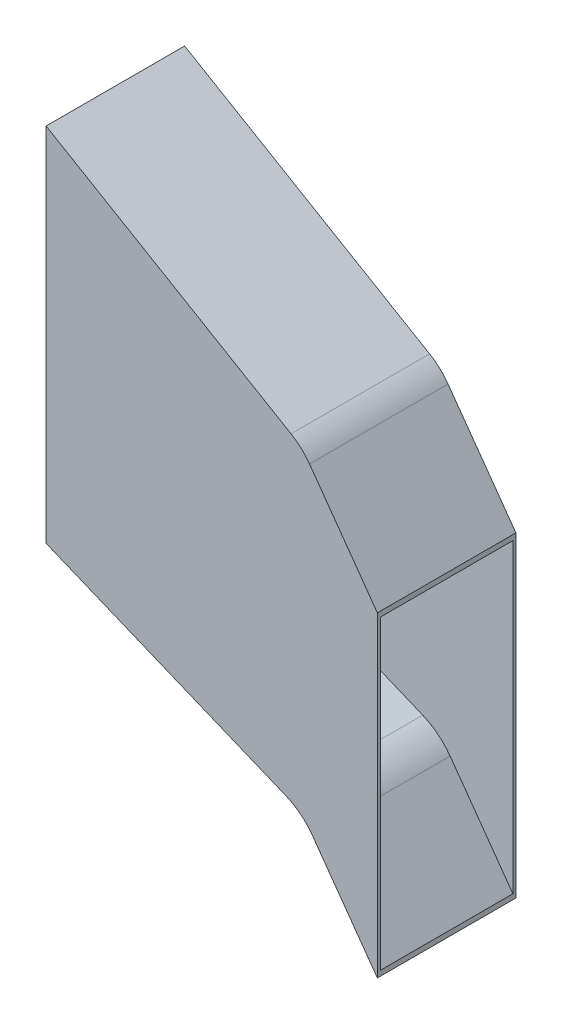
ISO-10303-21;
HEADER;
FILE_DESCRIPTION(('STEP AP214'),'2;1');
FILE_NAME('part.step','',(''),(''),'','','');
FILE_SCHEMA(('AUTOMOTIVE_DESIGN { 1 0 10303 214 1 1 1 1 }'));
ENDSEC;
DATA;
#1=APPLICATION_CONTEXT('core data for automotive mechanical design processes');
#2=APPLICATION_PROTOCOL_DEFINITION('international standard','automotive_design',2000,#1);
#3=PRODUCT_CONTEXT('',#1,'mechanical');
#4=PRODUCT('Part','Part','',(#3));
#5=PRODUCT_RELATED_PRODUCT_CATEGORY('part','',(#4));
#6=PRODUCT_DEFINITION_FORMATION('','',#4);
#7=PRODUCT_DEFINITION_CONTEXT('part definition',#1,'design');
#8=PRODUCT_DEFINITION('design','',#6,#7);
#9=PRODUCT_DEFINITION_SHAPE('','',#8);
#10=(LENGTH_UNIT() NAMED_UNIT(*) SI_UNIT(.MILLI.,.METRE.));
#11=(NAMED_UNIT(*) PLANE_ANGLE_UNIT() SI_UNIT($,.RADIAN.));
#12=(NAMED_UNIT(*) SI_UNIT($,.STERADIAN.) SOLID_ANGLE_UNIT());
#13=UNCERTAINTY_MEASURE_WITH_UNIT(LENGTH_MEASURE(1.E-05),#10,'distance_accuracy_value','');
#14=(GEOMETRIC_REPRESENTATION_CONTEXT(3) GLOBAL_UNCERTAINTY_ASSIGNED_CONTEXT((#13)) GLOBAL_UNIT_ASSIGNED_CONTEXT((#10,
#11,#12)) REPRESENTATION_CONTEXT('',''));
#15=CARTESIAN_POINT('',(0.,0.,0.));
#16=DIRECTION('',(0.,0.,1.));
#17=DIRECTION('',(1.,0.,0.));
#18=AXIS2_PLACEMENT_3D('',#15,#16,#17);
#19=CARTESIAN_POINT('',(0.,0.,116.84));
#20=DIRECTION('',(-1.,0.,0.));
#21=DIRECTION('',(0.,0.,1.));
#22=AXIS2_PLACEMENT_3D('',#19,#20,#21);
#23=PLANE('',#22);
#24=DIRECTION('',(0.,1.,0.));
#25=VECTOR('',#24,1.);
#26=CARTESIAN_POINT('',(0.,0.,0.));
#27=LINE('',#26,#25);
#28=CARTESIAN_POINT('',(0.,0.,0.));
#29=VERTEX_POINT('',#28);
#30=CARTESIAN_POINT('',(0.,266.7,0.));
#31=VERTEX_POINT('',#30);
#32=EDGE_CURVE('E251',#29,#31,#27,.T.);
#33=ORIENTED_EDGE('',*,*,#32,.T.);
#34=DIRECTION('',(0.,0.,-1.));
#35=VECTOR('',#34,1.);
#36=CARTESIAN_POINT('',(0.,266.7,116.84));
#37=LINE('',#36,#35);
#38=CARTESIAN_POINT('',(0.,266.7,116.84));
#39=VERTEX_POINT('',#38);
#40=EDGE_CURVE('E275',#39,#31,#37,.T.);
#41=ORIENTED_EDGE('',*,*,#40,.F.);
#42=DIRECTION('',(0.,1.,0.));
#43=VECTOR('',#42,1.);
#44=CARTESIAN_POINT('',(0.,0.,116.84));
#45=LINE('',#44,#43);
#46=CARTESIAN_POINT('',(0.,0.,116.84));
#47=VERTEX_POINT('',#46);
#48=EDGE_CURVE('E229',#47,#39,#45,.T.);
#49=ORIENTED_EDGE('',*,*,#48,.F.);
#50=DIRECTION('',(0.,0.,-1.));
#51=VECTOR('',#50,1.);
#52=CARTESIAN_POINT('',(0.,0.,116.84));
#53=LINE('',#52,#51);
#54=EDGE_CURVE('E279',#47,#29,#53,.T.);
#55=ORIENTED_EDGE('',*,*,#54,.T.);
#56=EDGE_LOOP('',(#33,#41,#49,#55));
#57=FACE_BOUND('',#56,.T.);
#58=DIRECTION('',(0.,1.,0.));
#59=VECTOR('',#58,1.);
#60=CARTESIAN_POINT('',(0.,0.,2.54));
#61=LINE('',#60,#59);
#62=CARTESIAN_POINT('',(0.,4.36998123565764,2.54));
#63=VERTEX_POINT('',#62);
#64=CARTESIAN_POINT('',(0.,262.330018764342,2.54));
#65=VERTEX_POINT('',#64);
#66=EDGE_CURVE('E202',#63,#65,#61,.T.);
#67=ORIENTED_EDGE('',*,*,#66,.F.);
#68=DIRECTION('',(0.,0.,-1.));
#69=VECTOR('',#68,1.);
#70=CARTESIAN_POINT('',(0.,4.36998123565764,116.84));
#71=LINE('',#70,#69);
#72=CARTESIAN_POINT('',(0.,4.36998123565764,114.3));
#73=VERTEX_POINT('',#72);
#74=EDGE_CURVE('E186',#73,#63,#71,.T.);
#75=ORIENTED_EDGE('',*,*,#74,.F.);
#76=DIRECTION('',(0.,1.,0.));
#77=VECTOR('',#76,1.);
#78=CARTESIAN_POINT('',(0.,0.,114.3));
#79=LINE('',#78,#77);
#80=CARTESIAN_POINT('',(0.,262.330018764342,114.3));
#81=VERTEX_POINT('',#80);
#82=EDGE_CURVE('E63',#73,#81,#79,.T.);
#83=ORIENTED_EDGE('',*,*,#82,.T.);
#84=DIRECTION('',(0.,0.,-1.));
#85=VECTOR('',#84,1.);
#86=CARTESIAN_POINT('',(0.,262.330018764342,116.84));
#87=LINE('',#86,#85);
#88=EDGE_CURVE('E192',#81,#65,#87,.T.);
#89=ORIENTED_EDGE('',*,*,#88,.T.);
#90=EDGE_LOOP('',(#67,#75,#83,#89));
#91=FACE_BOUND('',#90,.T.);
#92=ADVANCED_FACE('F47',(#57,#91),#23,.F.);
#93=CARTESIAN_POINT('',(-279.4,482.6,116.84));
#94=DIRECTION('',(1.,0.,0.));
#95=DIRECTION('',(0.,1.,0.));
#96=AXIS2_PLACEMENT_3D('',#93,#94,#95);
#97=PLANE('',#96);
#98=DIRECTION('',(0.,-1.,0.));
#99=VECTOR('',#98,1.);
#100=CARTESIAN_POINT('',(-279.4,482.6,0.));
#101=LINE('',#100,#99);
#102=CARTESIAN_POINT('',(-279.4,482.6,0.));
#103=VERTEX_POINT('',#102);
#104=CARTESIAN_POINT('',(-279.4,177.8,0.));
#105=VERTEX_POINT('',#104);
#106=EDGE_CURVE('E262',#103,#105,#101,.T.);
#107=ORIENTED_EDGE('',*,*,#106,.T.);
#108=DIRECTION('',(0.,0.,-1.));
#109=VECTOR('',#108,1.);
#110=CARTESIAN_POINT('',(-279.4,177.8,116.84));
#111=LINE('',#110,#109);
#112=CARTESIAN_POINT('',(-279.4,177.8,116.84));
#113=VERTEX_POINT('',#112);
#114=EDGE_CURVE('E247',#113,#105,#111,.T.);
#115=ORIENTED_EDGE('',*,*,#114,.F.);
#116=DIRECTION('',(0.,-1.,0.));
#117=VECTOR('',#116,1.);
#118=CARTESIAN_POINT('',(-279.4,482.6,116.84));
#119=LINE('',#118,#117);
#120=CARTESIAN_POINT('',(-279.4,482.6,116.84));
#121=VERTEX_POINT('',#120);
#122=EDGE_CURVE('E240',#121,#113,#119,.T.);
#123=ORIENTED_EDGE('',*,*,#122,.F.);
#124=DIRECTION('',(0.,0.,-1.));
#125=VECTOR('',#124,1.);
#126=CARTESIAN_POINT('',(-279.4,482.6,116.84));
#127=LINE('',#126,#125);
#128=EDGE_CURVE('E271',#121,#103,#127,.T.);
#129=ORIENTED_EDGE('',*,*,#128,.T.);
#130=EDGE_LOOP('',(#107,#115,#123,#129));
#131=FACE_BOUND('',#130,.T.);
#132=DIRECTION('',(0.,-1.,0.));
#133=VECTOR('',#132,1.);
#134=CARTESIAN_POINT('',(-279.4,482.6,2.54));
#135=LINE('',#134,#133);
#136=CARTESIAN_POINT('',(-279.4,479.653139374987,2.54));
#137=VERTEX_POINT('',#136);
#138=CARTESIAN_POINT('',(-279.4,180.546901872327,2.54));
#139=VERTEX_POINT('',#138);
#140=EDGE_CURVE('E220',#137,#139,#135,.T.);
#141=ORIENTED_EDGE('',*,*,#140,.F.);
#142=DIRECTION('',(0.,0.,-1.));
#143=VECTOR('',#142,1.);
#144=CARTESIAN_POINT('',(-279.4,479.653139374987,116.84));
#145=LINE('',#144,#143);
#146=CARTESIAN_POINT('',(-279.4,479.653139374987,114.3));
#147=VERTEX_POINT('',#146);
#148=EDGE_CURVE('E210',#147,#137,#145,.T.);
#149=ORIENTED_EDGE('',*,*,#148,.F.);
#150=DIRECTION('',(0.,-1.,0.));
#151=VECTOR('',#150,1.);
#152=CARTESIAN_POINT('',(-279.4,482.6,114.3));
#153=LINE('',#152,#151);
#154=CARTESIAN_POINT('',(-279.4,180.546901872327,114.3));
#155=VERTEX_POINT('',#154);
#156=EDGE_CURVE('E70',#147,#155,#153,.T.);
#157=ORIENTED_EDGE('',*,*,#156,.T.);
#158=DIRECTION('',(0.,0.,-1.));
#159=VECTOR('',#158,1.);
#160=CARTESIAN_POINT('',(-279.4,180.546901872327,116.84));
#161=LINE('',#160,#159);
#162=EDGE_CURVE('E219',#155,#139,#161,.T.);
#163=ORIENTED_EDGE('',*,*,#162,.T.);
#164=EDGE_LOOP('',(#141,#149,#157,#163));
#165=FACE_BOUND('',#164,.T.);
#166=ADVANCED_FACE('F341',(#131,#165),#97,.F.);
#167=CARTESIAN_POINT('',(-63.5,88.9,116.84));
#168=DIRECTION('',(0.813733471206735,0.581238193719097,0.));
#169=DIRECTION('',(-0.581238193719097,0.813733471206735,0.));
#170=AXIS2_PLACEMENT_3D('',#167,#168,#169);
#171=PLANE('',#170);
#172=DIRECTION('',(0.581238193719096,-0.813733471206735,0.));
#173=VECTOR('',#172,1.);
#174=CARTESIAN_POINT('',(-63.5,88.9,116.84));
#175=LINE('',#174,#173);
#176=CARTESIAN_POINT('',(-55.0103743967699,77.0145241554779,116.84));
#177=VERTEX_POINT('',#176);
#178=EDGE_CURVE('E226',#177,#47,#175,.T.);
#179=ORIENTED_EDGE('',*,*,#178,.F.);
#180=DIRECTION('',(0.,0.,-1.));
#181=VECTOR('',#180,1.);
#182=CARTESIAN_POINT('',(-55.0103743967699,77.0145241554779,0.));
#183=LINE('',#182,#181);
#184=CARTESIAN_POINT('',(-55.0103743967699,77.0145241554779,0.));
#185=VERTEX_POINT('',#184);
#186=EDGE_CURVE('E296',#177,#185,#183,.T.);
#187=ORIENTED_EDGE('',*,*,#186,.T.);
#188=DIRECTION('',(0.581238193719096,-0.813733471206735,0.));
#189=VECTOR('',#188,1.);
#190=CARTESIAN_POINT('',(-63.5,88.9,0.));
#191=LINE('',#190,#189);
#192=EDGE_CURVE('E248',#185,#29,#191,.T.);
#193=ORIENTED_EDGE('',*,*,#192,.T.);
#194=ORIENTED_EDGE('',*,*,#54,.F.);
#195=EDGE_LOOP('',(#179,#187,#193,#194));
#196=FACE_BOUND('',#195,.T.);
#197=ADVANCED_FACE('F324',(#196),#171,.F.);
#198=CARTESIAN_POINT('',(0.,266.7,116.84));
#199=DIRECTION('',(-0.813733471206735,-0.581238193719097,0.));
#200=DIRECTION('',(0.581238193719097,-0.813733471206735,0.));
#201=AXIS2_PLACEMENT_3D('',#198,#199,#200);
#202=PLANE('',#201);
#203=DIRECTION('',(-0.581238193719097,0.813733471206735,0.));
#204=VECTOR('',#203,1.);
#205=CARTESIAN_POINT('',(0.,266.7,0.));
#206=LINE('',#205,#204);
#207=CARTESIAN_POINT('',(-57.224731519158,346.814624126821,0.));
#208=VERTEX_POINT('',#207);
#209=EDGE_CURVE('E255',#31,#208,#206,.T.);
#210=ORIENTED_EDGE('',*,*,#209,.T.);
#211=DIRECTION('',(0.,0.,-1.));
#212=VECTOR('',#211,1.);
#213=CARTESIAN_POINT('',(-57.224731519158,346.814624126821,116.84));
#214=LINE('',#213,#212);
#215=CARTESIAN_POINT('',(-57.224731519158,346.814624126821,116.84));
#216=VERTEX_POINT('',#215);
#217=EDGE_CURVE('E290',#208,#216,#214,.F.);
#218=ORIENTED_EDGE('',*,*,#217,.T.);
#219=DIRECTION('',(-0.581238193719097,0.813733471206735,0.));
#220=VECTOR('',#219,1.);
#221=CARTESIAN_POINT('',(0.,266.7,116.84));
#222=LINE('',#221,#220);
#223=EDGE_CURVE('E233',#39,#216,#222,.T.);
#224=ORIENTED_EDGE('',*,*,#223,.F.);
#225=ORIENTED_EDGE('',*,*,#40,.T.);
#226=EDGE_LOOP('',(#210,#218,#224,#225));
#227=FACE_BOUND('',#226,.T.);
#228=ADVANCED_FACE('F403',(#227),#202,.F.);
#229=CARTESIAN_POINT('',(-63.5000000000001,355.6,116.84));
#230=DIRECTION('',(-0.507020126563394,-0.86193421515777,0.));
#231=DIRECTION('',(0.861934215157769,-0.507020126563394,0.));
#232=AXIS2_PLACEMENT_3D('',#229,#230,#231);
#233=PLANE('',#232);
#234=DIRECTION('',(-0.86193421515777,0.507020126563394,0.));
#235=VECTOR('',#234,1.);
#236=CARTESIAN_POINT('',(-63.5000000000001,355.6,116.84));
#237=LINE('',#236,#235);
#238=CARTESIAN_POINT('',(-72.8057694270398,361.073982015906,116.84));
#239=VERTEX_POINT('',#238);
#240=EDGE_CURVE('E237',#239,#121,#237,.T.);
#241=ORIENTED_EDGE('',*,*,#240,.F.);
#242=DIRECTION('',(0.,0.,-1.));
#243=VECTOR('',#242,1.);
#244=CARTESIAN_POINT('',(-72.8057694270398,361.073982015906,116.84));
#245=LINE('',#244,#243);
#246=CARTESIAN_POINT('',(-72.8057694270398,361.073982015906,0.));
#247=VERTEX_POINT('',#246);
#248=EDGE_CURVE('E283',#239,#247,#245,.T.);
#249=ORIENTED_EDGE('',*,*,#248,.T.);
#250=DIRECTION('',(-0.86193421515777,0.507020126563394,0.));
#251=VECTOR('',#250,1.);
#252=CARTESIAN_POINT('',(-63.5000000000001,355.6,0.));
#253=LINE('',#252,#251);
#254=EDGE_CURVE('E259',#247,#103,#253,.T.);
#255=ORIENTED_EDGE('',*,*,#254,.T.);
#256=ORIENTED_EDGE('',*,*,#128,.F.);
#257=EDGE_LOOP('',(#241,#249,#255,#256));
#258=FACE_BOUND('',#257,.T.);
#259=ADVANCED_FACE('F337',(#258),#233,.F.);
#260=CARTESIAN_POINT('',(-279.4,177.8,116.84));
#261=DIRECTION('',(0.380749805254295,0.924678098474716,0.));
#262=DIRECTION('',(-0.924678098474716,0.380749805254295,0.));
#263=AXIS2_PLACEMENT_3D('',#260,#261,#262);
#264=PLANE('',#263);
#265=DIRECTION('',(0.924678098474716,-0.380749805254295,0.));
#266=VECTOR('',#265,1.);
#267=CARTESIAN_POINT('',(-279.4,177.8,0.));
#268=LINE('',#267,#266);
#269=CARTESIAN_POINT('',(-77.0059446271539,94.4612713170634,0.));
#270=VERTEX_POINT('',#269);
#271=EDGE_CURVE('E230',#105,#270,#268,.T.);
#272=ORIENTED_EDGE('',*,*,#271,.T.);
#273=DIRECTION('',(0.,0.,-1.));
#274=VECTOR('',#273,1.);
#275=CARTESIAN_POINT('',(-77.0059446271539,94.4612713170633,116.84));
#276=LINE('',#275,#274);
#277=CARTESIAN_POINT('',(-77.0059446271539,94.4612713170634,116.84));
#278=VERTEX_POINT('',#277);
#279=EDGE_CURVE('E300',#270,#278,#276,.F.);
#280=ORIENTED_EDGE('',*,*,#279,.T.);
#281=DIRECTION('',(0.924678098474716,-0.380749805254295,0.));
#282=VECTOR('',#281,1.);
#283=CARTESIAN_POINT('',(-279.4,177.8,116.84));
#284=LINE('',#283,#282);
#285=EDGE_CURVE('E243',#113,#278,#284,.T.);
#286=ORIENTED_EDGE('',*,*,#285,.F.);
#287=ORIENTED_EDGE('',*,*,#114,.T.);
#288=EDGE_LOOP('',(#272,#280,#286,#287));
#289=FACE_BOUND('',#288,.T.);
#290=ADVANCED_FACE('F314',(#289),#264,.F.);
#291=CARTESIAN_POINT('',(0.,0.,116.84));
#292=DIRECTION('',(0.,0.,1.));
#293=DIRECTION('',(1.,0.,0.));
#294=AXIS2_PLACEMENT_3D('',#291,#292,#293);
#295=PLANE('',#294);
#296=ORIENTED_EDGE('',*,*,#223,.T.);
#297=CARTESIAN_POINT('',(-98.5623918564602,317.287723885891,116.84));
#298=DIRECTION('',(0.,0.,1.));
#299=DIRECTION('',(1.,0.,0.));
#300=AXIS2_PLACEMENT_3D('',#297,#298,#299);
#301=CIRCLE('',#300,50.8);
#302=EDGE_CURVE('E293',#216,#239,#301,.T.);
#303=ORIENTED_EDGE('',*,*,#302,.T.);
#304=ORIENTED_EDGE('',*,*,#240,.T.);
#305=ORIENTED_EDGE('',*,*,#122,.T.);
#306=ORIENTED_EDGE('',*,*,#285,.T.);
#307=CARTESIAN_POINT('',(-96.3480347340721,47.4876239145478,116.84));
#308=DIRECTION('',(0.,0.,1.));
#309=DIRECTION('',(1.,0.,0.));
#310=AXIS2_PLACEMENT_3D('',#307,#308,#309);
#311=CIRCLE('',#310,50.8);
#312=EDGE_CURVE('E11',#278,#177,#311,.F.);
#313=ORIENTED_EDGE('',*,*,#312,.T.);
#314=ORIENTED_EDGE('',*,*,#178,.T.);
#315=ORIENTED_EDGE('',*,*,#48,.T.);
#316=EDGE_LOOP('',(#296,#303,#304,#305,#306,#313,#314,#315));
#317=FACE_BOUND('',#316,.T.);
#318=ADVANCED_FACE('F320',(#317),#295,.T.);
#319=CARTESIAN_POINT('',(0.,0.,0.));
#320=DIRECTION('',(0.,0.,1.));
#321=DIRECTION('',(1.,0.,0.));
#322=AXIS2_PLACEMENT_3D('',#319,#320,#321);
#323=PLANE('',#322);
#324=ORIENTED_EDGE('',*,*,#254,.F.);
#325=CARTESIAN_POINT('',(-98.5623918564602,317.287723885891,0.));
#326=DIRECTION('',(0.,0.,1.));
#327=DIRECTION('',(1.,0.,0.));
#328=AXIS2_PLACEMENT_3D('',#325,#326,#327);
#329=CIRCLE('',#328,50.8);
#330=EDGE_CURVE('E287',#247,#208,#329,.F.);
#331=ORIENTED_EDGE('',*,*,#330,.T.);
#332=ORIENTED_EDGE('',*,*,#209,.F.);
#333=ORIENTED_EDGE('',*,*,#32,.F.);
#334=ORIENTED_EDGE('',*,*,#192,.F.);
#335=CARTESIAN_POINT('',(-96.3480347340721,47.4876239145478,0.));
#336=DIRECTION('',(0.,0.,1.));
#337=DIRECTION('',(1.,0.,0.));
#338=AXIS2_PLACEMENT_3D('',#335,#336,#337);
#339=CIRCLE('',#338,50.8);
#340=EDGE_CURVE('E56',#185,#270,#339,.T.);
#341=ORIENTED_EDGE('',*,*,#340,.T.);
#342=ORIENTED_EDGE('',*,*,#271,.F.);
#343=ORIENTED_EDGE('',*,*,#106,.F.);
#344=EDGE_LOOP('',(#324,#331,#332,#333,#334,#341,#342,#343));
#345=FACE_BOUND('',#344,.T.);
#346=ADVANCED_FACE('F307',(#345),#323,.F.);
#347=CARTESIAN_POINT('',(-98.5623918564602,317.287723885891,116.84));
#348=DIRECTION('',(0.,0.,-1.));
#349=DIRECTION('',(-1.,0.,0.));
#350=AXIS2_PLACEMENT_3D('',#347,#348,#349);
#351=CYLINDRICAL_SURFACE('',#350,50.8);
#352=ORIENTED_EDGE('',*,*,#302,.F.);
#353=ORIENTED_EDGE('',*,*,#217,.F.);
#354=ORIENTED_EDGE('',*,*,#330,.F.);
#355=ORIENTED_EDGE('',*,*,#248,.F.);
#356=EDGE_LOOP('',(#352,#353,#354,#355));
#357=FACE_BOUND('',#356,.T.);
#358=ADVANCED_FACE('F335',(#357),#351,.T.);
#359=CARTESIAN_POINT('',(-96.3480347340721,47.4876239145478,116.84));
#360=DIRECTION('',(0.,0.,1.));
#361=DIRECTION('',(1.,0.,0.));
#362=AXIS2_PLACEMENT_3D('',#359,#360,#361);
#363=CYLINDRICAL_SURFACE('',#362,50.8);
#364=ORIENTED_EDGE('',*,*,#312,.F.);
#365=ORIENTED_EDGE('',*,*,#279,.F.);
#366=ORIENTED_EDGE('',*,*,#340,.F.);
#367=ORIENTED_EDGE('',*,*,#186,.F.);
#368=EDGE_LOOP('',(#364,#365,#366,#367));
#369=FACE_BOUND('',#368,.T.);
#370=ADVANCED_FACE('F49',(#369),#363,.F.);
#371=CARTESIAN_POINT('',(-61.4331169831349,90.3763450120465,116.84));
#372=DIRECTION('',(0.813733471206735,0.581238193719097,0.));
#373=DIRECTION('',(-0.581238193719097,0.813733471206735,0.));
#374=AXIS2_PLACEMENT_3D('',#371,#372,#373);
#375=PLANE('',#374);
#376=DIRECTION('',(0.581238193719096,-0.813733471206735,0.));
#377=VECTOR('',#376,1.);
#378=CARTESIAN_POINT('',(-61.4331169831349,90.3763450120465,114.3));
#379=LINE('',#378,#377);
#380=CARTESIAN_POINT('',(-52.9434913799048,78.4908691675244,114.3));
#381=VERTEX_POINT('',#380);
#382=EDGE_CURVE('E213',#381,#73,#379,.T.);
#383=ORIENTED_EDGE('',*,*,#382,.T.);
#384=ORIENTED_EDGE('',*,*,#74,.T.);
#385=DIRECTION('',(0.581238193719096,-0.813733471206735,0.));
#386=VECTOR('',#385,1.);
#387=CARTESIAN_POINT('',(-61.4331169831349,90.3763450120465,2.53999999999999));
#388=LINE('',#387,#386);
#389=CARTESIAN_POINT('',(-52.9434913799048,78.4908691675244,2.53999999999999));
#390=VERTEX_POINT('',#389);
#391=EDGE_CURVE('E206',#390,#63,#388,.T.);
#392=ORIENTED_EDGE('',*,*,#391,.F.);
#393=DIRECTION('',(0.,0.,1.));
#394=VECTOR('',#393,1.);
#395=CARTESIAN_POINT('',(-52.9434913799048,78.4908691675244,116.84));
#396=LINE('',#395,#394);
#397=EDGE_CURVE('E172',#381,#390,#396,.F.);
#398=ORIENTED_EDGE('',*,*,#397,.F.);
#399=EDGE_LOOP('',(#383,#384,#392,#398));
#400=FACE_BOUND('',#399,.T.);
#401=ADVANCED_FACE('F385',(#400),#375,.T.);
#402=CARTESIAN_POINT('',(-2.06688301686511,265.223654987953,116.84));
#403=DIRECTION('',(-0.813733471206735,-0.581238193719097,0.));
#404=DIRECTION('',(0.581238193719097,-0.813733471206735,0.));
#405=AXIS2_PLACEMENT_3D('',#402,#403,#404);
#406=PLANE('',#405);
#407=DIRECTION('',(-0.581238193719097,0.813733471206735,0.));
#408=VECTOR('',#407,1.);
#409=CARTESIAN_POINT('',(-2.06688301686511,265.223654987953,2.53999999999999));
#410=LINE('',#409,#408);
#411=CARTESIAN_POINT('',(-59.2916145360231,345.338279114775,2.53999999999999));
#412=VERTEX_POINT('',#411);
#413=EDGE_CURVE('E205',#65,#412,#410,.T.);
#414=ORIENTED_EDGE('',*,*,#413,.F.);
#415=ORIENTED_EDGE('',*,*,#88,.F.);
#416=DIRECTION('',(-0.581238193719097,0.813733471206735,0.));
#417=VECTOR('',#416,1.);
#418=CARTESIAN_POINT('',(-2.06688301686511,265.223654987953,114.3));
#419=LINE('',#418,#417);
#420=CARTESIAN_POINT('',(-59.2916145360231,345.338279114775,114.3));
#421=VERTEX_POINT('',#420);
#422=EDGE_CURVE('E180',#81,#421,#419,.T.);
#423=ORIENTED_EDGE('',*,*,#422,.T.);
#424=DIRECTION('',(0.,0.,1.));
#425=VECTOR('',#424,1.);
#426=CARTESIAN_POINT('',(-59.2916145360231,345.338279114775,116.84));
#427=LINE('',#426,#425);
#428=EDGE_CURVE('E169',#412,#421,#427,.T.);
#429=ORIENTED_EDGE('',*,*,#428,.F.);
#430=EDGE_LOOP('',(#414,#415,#423,#429));
#431=FACE_BOUND('',#430,.T.);
#432=ADVANCED_FACE('F387',(#431),#406,.T.);
#433=CARTESIAN_POINT('',(-64.7878311214711,353.410687093499,116.84));
#434=DIRECTION('',(-0.507020126563394,-0.86193421515777,0.));
#435=DIRECTION('',(0.861934215157769,-0.507020126563394,0.));
#436=AXIS2_PLACEMENT_3D('',#433,#434,#435);
#437=PLANE('',#436);
#438=DIRECTION('',(-0.86193421515777,0.507020126563394,0.));
#439=VECTOR('',#438,1.);
#440=CARTESIAN_POINT('',(-64.7878311214711,353.410687093499,114.3));
#441=LINE('',#440,#439);
#442=CARTESIAN_POINT('',(-74.0936005485108,358.884669109405,114.3));
#443=VERTEX_POINT('',#442);
#444=EDGE_CURVE('E174',#443,#147,#441,.T.);
#445=ORIENTED_EDGE('',*,*,#444,.T.);
#446=ORIENTED_EDGE('',*,*,#148,.T.);
#447=DIRECTION('',(-0.86193421515777,0.507020126563394,0.));
#448=VECTOR('',#447,1.);
#449=CARTESIAN_POINT('',(-64.7878311214711,353.410687093499,2.53999999999999));
#450=LINE('',#449,#448);
#451=CARTESIAN_POINT('',(-74.0936005485108,358.884669109405,2.54));
#452=VERTEX_POINT('',#451);
#453=EDGE_CURVE('E183',#452,#137,#450,.T.);
#454=ORIENTED_EDGE('',*,*,#453,.F.);
#455=DIRECTION('',(0.,0.,1.));
#456=VECTOR('',#455,1.);
#457=CARTESIAN_POINT('',(-74.0936005485108,358.884669109405,116.84));
#458=LINE('',#457,#456);
#459=EDGE_CURVE('E166',#443,#452,#458,.F.);
#460=ORIENTED_EDGE('',*,*,#459,.F.);
#461=EDGE_LOOP('',(#445,#446,#454,#460));
#462=FACE_BOUND('',#461,.T.);
#463=ADVANCED_FACE('F182',(#462),#437,.T.);
#464=CARTESIAN_POINT('',(-278.432895494654,180.148682370126,116.84));
#465=DIRECTION('',(0.380749805254295,0.924678098474716,0.));
#466=DIRECTION('',(-0.924678098474716,0.380749805254295,0.));
#467=AXIS2_PLACEMENT_3D('',#464,#465,#466);
#468=PLANE('',#467);
#469=DIRECTION('',(0.924678098474716,-0.380749805254295,0.));
#470=VECTOR('',#469,1.);
#471=CARTESIAN_POINT('',(-278.432895494654,180.148682370126,2.53999999999999));
#472=LINE('',#471,#470);
#473=CARTESIAN_POINT('',(-76.038840121808,96.8099536871892,2.54));
#474=VERTEX_POINT('',#473);
#475=EDGE_CURVE('E196',#139,#474,#472,.T.);
#476=ORIENTED_EDGE('',*,*,#475,.F.);
#477=ORIENTED_EDGE('',*,*,#162,.F.);
#478=DIRECTION('',(0.924678098474716,-0.380749805254295,0.));
#479=VECTOR('',#478,1.);
#480=CARTESIAN_POINT('',(-278.432895494654,180.148682370126,114.3));
#481=LINE('',#480,#479);
#482=CARTESIAN_POINT('',(-76.038840121808,96.8099536871892,114.3));
#483=VERTEX_POINT('',#482);
#484=EDGE_CURVE('E216',#155,#483,#481,.T.);
#485=ORIENTED_EDGE('',*,*,#484,.T.);
#486=DIRECTION('',(0.,0.,1.));
#487=VECTOR('',#486,1.);
#488=CARTESIAN_POINT('',(-76.038840121808,96.8099536871892,116.84));
#489=LINE('',#488,#487);
#490=EDGE_CURVE('E198',#474,#483,#489,.T.);
#491=ORIENTED_EDGE('',*,*,#490,.F.);
#492=EDGE_LOOP('',(#476,#477,#485,#491));
#493=FACE_BOUND('',#492,.T.);
#494=ADVANCED_FACE('F353',(#493),#468,.T.);
#495=CARTESIAN_POINT('',(0.,0.,114.3));
#496=DIRECTION('',(0.,0.,1.));
#497=DIRECTION('',(1.,0.,0.));
#498=AXIS2_PLACEMENT_3D('',#495,#496,#497);
#499=PLANE('',#498);
#500=ORIENTED_EDGE('',*,*,#422,.F.);
#501=ORIENTED_EDGE('',*,*,#82,.F.);
#502=ORIENTED_EDGE('',*,*,#382,.F.);
#503=CARTESIAN_POINT('',(-96.3480347340721,47.4876239145478,114.3));
#504=DIRECTION('',(0.,0.,1.));
#505=DIRECTION('',(1.,0.,0.));
#506=AXIS2_PLACEMENT_3D('',#503,#504,#505);
#507=CIRCLE('',#506,53.34);
#508=EDGE_CURVE('E252',#483,#381,#507,.F.);
#509=ORIENTED_EDGE('',*,*,#508,.F.);
#510=ORIENTED_EDGE('',*,*,#484,.F.);
#511=ORIENTED_EDGE('',*,*,#156,.F.);
#512=ORIENTED_EDGE('',*,*,#444,.F.);
#513=CARTESIAN_POINT('',(-98.5623918564602,317.287723885891,114.3));
#514=DIRECTION('',(0.,0.,1.));
#515=DIRECTION('',(1.,0.,0.));
#516=AXIS2_PLACEMENT_3D('',#513,#514,#515);
#517=CIRCLE('',#516,48.26);
#518=EDGE_CURVE('E163',#421,#443,#517,.T.);
#519=ORIENTED_EDGE('',*,*,#518,.F.);
#520=EDGE_LOOP('',(#500,#501,#502,#509,#510,#511,#512,#519));
#521=FACE_BOUND('',#520,.T.);
#522=ADVANCED_FACE('F175',(#521),#499,.F.);
#523=CARTESIAN_POINT('',(0.,0.,2.54));
#524=DIRECTION('',(0.,0.,1.));
#525=DIRECTION('',(1.,0.,0.));
#526=AXIS2_PLACEMENT_3D('',#523,#524,#525);
#527=PLANE('',#526);
#528=ORIENTED_EDGE('',*,*,#453,.T.);
#529=ORIENTED_EDGE('',*,*,#140,.T.);
#530=ORIENTED_EDGE('',*,*,#475,.T.);
#531=CARTESIAN_POINT('',(-96.3480347340721,47.4876239145478,2.54));
#532=DIRECTION('',(0.,0.,1.));
#533=DIRECTION('',(1.,0.,0.));
#534=AXIS2_PLACEMENT_3D('',#531,#532,#533);
#535=CIRCLE('',#534,53.34);
#536=EDGE_CURVE('E200',#390,#474,#535,.T.);
#537=ORIENTED_EDGE('',*,*,#536,.F.);
#538=ORIENTED_EDGE('',*,*,#391,.T.);
#539=ORIENTED_EDGE('',*,*,#66,.T.);
#540=ORIENTED_EDGE('',*,*,#413,.T.);
#541=CARTESIAN_POINT('',(-98.5623918564602,317.287723885891,2.54));
#542=DIRECTION('',(0.,0.,1.));
#543=DIRECTION('',(1.,0.,0.));
#544=AXIS2_PLACEMENT_3D('',#541,#542,#543);
#545=CIRCLE('',#544,48.26);
#546=EDGE_CURVE('E185',#452,#412,#545,.F.);
#547=ORIENTED_EDGE('',*,*,#546,.F.);
#548=EDGE_LOOP('',(#528,#529,#530,#537,#538,#539,#540,#547));
#549=FACE_BOUND('',#548,.T.);
#550=ADVANCED_FACE('F350',(#549),#527,.T.);
#551=CARTESIAN_POINT('',(-98.5623918564602,317.287723885891,116.84));
#552=DIRECTION('',(0.,0.,-1.));
#553=DIRECTION('',(-1.,0.,0.));
#554=AXIS2_PLACEMENT_3D('',#551,#552,#553);
#555=CYLINDRICAL_SURFACE('',#554,48.26);
#556=ORIENTED_EDGE('',*,*,#518,.T.);
#557=ORIENTED_EDGE('',*,*,#459,.T.);
#558=ORIENTED_EDGE('',*,*,#546,.T.);
#559=ORIENTED_EDGE('',*,*,#428,.T.);
#560=EDGE_LOOP('',(#556,#557,#558,#559));
#561=FACE_BOUND('',#560,.T.);
#562=ADVANCED_FACE('F164',(#561),#555,.F.);
#563=CARTESIAN_POINT('',(-96.3480347340721,47.4876239145478,116.84));
#564=DIRECTION('',(0.,0.,1.));
#565=DIRECTION('',(1.,0.,0.));
#566=AXIS2_PLACEMENT_3D('',#563,#564,#565);
#567=CYLINDRICAL_SURFACE('',#566,53.34);
#568=ORIENTED_EDGE('',*,*,#508,.T.);
#569=ORIENTED_EDGE('',*,*,#397,.T.);
#570=ORIENTED_EDGE('',*,*,#536,.T.);
#571=ORIENTED_EDGE('',*,*,#490,.T.);
#572=EDGE_LOOP('',(#568,#569,#570,#571));
#573=FACE_BOUND('',#572,.T.);
#574=ADVANCED_FACE('F381',(#573),#567,.T.);
#575=CLOSED_SHELL('',(#92,#166,#197,#228,#259,#290,#318,#346,#358,#370,#401,#432,#463,#494,#522,
#550,#562,#574));
#576=MANIFOLD_SOLID_BREP('B2',#575);
#577=ADVANCED_BREP_SHAPE_REPRESENTATION('',(#18,#576),#14);
#578=SHAPE_DEFINITION_REPRESENTATION(#9,#577);
ENDSEC;
END-ISO-10303-21;
